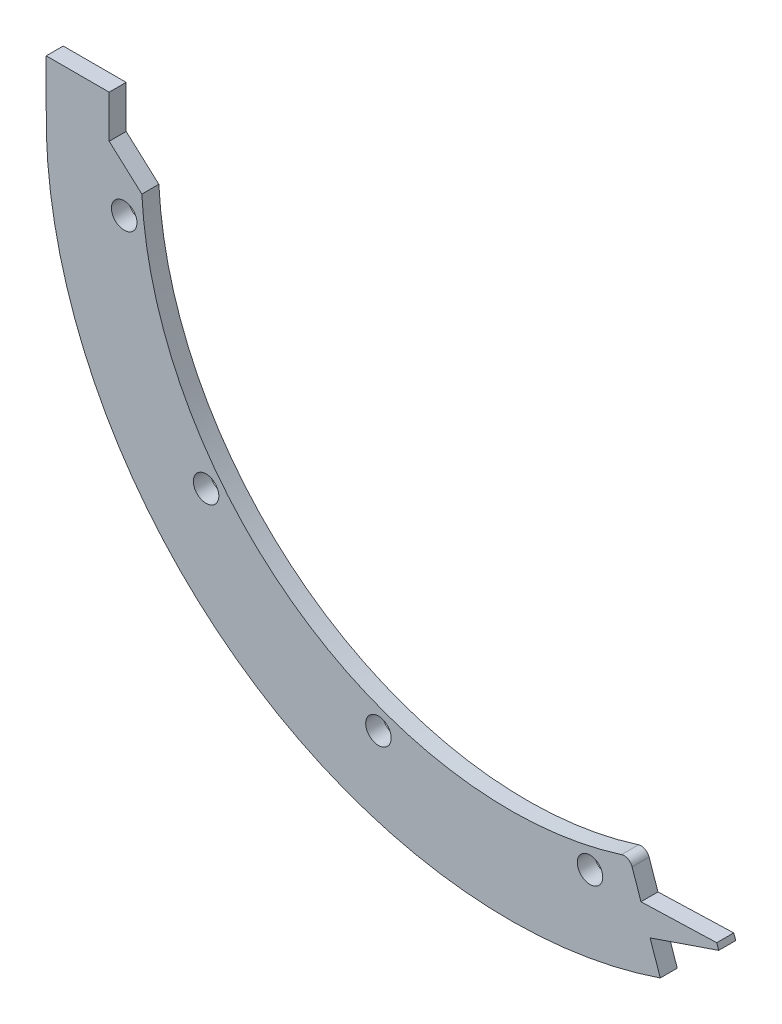
ISO-10303-21;
HEADER;
FILE_DESCRIPTION(('STEP AP214'),'2;1');
FILE_NAME('part.step','',(''),(''),'','','');
FILE_SCHEMA(('AUTOMOTIVE_DESIGN { 1 0 10303 214 1 1 1 1 }'));
ENDSEC;
DATA;
#1=APPLICATION_CONTEXT('core data for automotive mechanical design processes');
#2=APPLICATION_PROTOCOL_DEFINITION('international standard','automotive_design',2000,#1);
#3=PRODUCT_CONTEXT('',#1,'mechanical');
#4=PRODUCT('Part','Part','',(#3));
#5=PRODUCT_RELATED_PRODUCT_CATEGORY('part','',(#4));
#6=PRODUCT_DEFINITION_FORMATION('','',#4);
#7=PRODUCT_DEFINITION_CONTEXT('part definition',#1,'design');
#8=PRODUCT_DEFINITION('design','',#6,#7);
#9=PRODUCT_DEFINITION_SHAPE('','',#8);
#10=(LENGTH_UNIT() NAMED_UNIT(*) SI_UNIT(.MILLI.,.METRE.));
#11=(NAMED_UNIT(*) PLANE_ANGLE_UNIT() SI_UNIT($,.RADIAN.));
#12=(NAMED_UNIT(*) SI_UNIT($,.STERADIAN.) SOLID_ANGLE_UNIT());
#13=UNCERTAINTY_MEASURE_WITH_UNIT(LENGTH_MEASURE(1.E-05),#10,'distance_accuracy_value','');
#14=(GEOMETRIC_REPRESENTATION_CONTEXT(3) GLOBAL_UNCERTAINTY_ASSIGNED_CONTEXT((#13)) GLOBAL_UNIT_ASSIGNED_CONTEXT((#10,
#11,#12)) REPRESENTATION_CONTEXT('',''));
#15=CARTESIAN_POINT('',(0.,0.,0.));
#16=DIRECTION('',(0.,0.,1.));
#17=DIRECTION('',(1.,0.,0.));
#18=AXIS2_PLACEMENT_3D('',#15,#16,#17);
#19=CARTESIAN_POINT('',(11.614625443706,-128.278288384696,2.));
#20=DIRECTION('',(0.,0.,1.));
#21=DIRECTION('',(1.,0.,0.));
#22=AXIS2_PLACEMENT_3D('',#19,#20,#21);
#23=PLANE('',#22);
#24=CARTESIAN_POINT('',(-37.5438954317248,-114.478381177604,2.));
#25=DIRECTION('',(0.,0.,1.));
#26=DIRECTION('',(1.,0.,0.));
#27=AXIS2_PLACEMENT_3D('',#24,#25,#26);
#28=CIRCLE('',#27,1.5);
#29=CARTESIAN_POINT('',(-36.0438954317248,-114.478381177604,2.));
#30=VERTEX_POINT('',#29);
#31=EDGE_CURVE('E175',#30,#30,#28,.T.);
#32=ORIENTED_EDGE('',*,*,#31,.F.);
#33=EDGE_LOOP('',(#32));
#34=FACE_BOUND('',#33,.T.);
#35=CARTESIAN_POINT('',(7.60726233450452,-130.722795016162,2.));
#36=DIRECTION('',(0.,0.,1.));
#37=DIRECTION('',(1.,0.,0.));
#38=AXIS2_PLACEMENT_3D('',#35,#36,#37);
#39=CIRCLE('',#38,1.5);
#40=CARTESIAN_POINT('',(9.10726233450453,-130.722795016162,2.));
#41=VERTEX_POINT('',#40);
#42=EDGE_CURVE('E176',#41,#41,#39,.T.);
#43=ORIENTED_EDGE('',*,*,#42,.F.);
#44=EDGE_LOOP('',(#43));
#45=FACE_BOUND('',#44,.T.);
#46=DIRECTION('',(-0.323851463630344,0.946107937554951,0.));
#47=VECTOR('',#46,1.);
#48=CARTESIAN_POINT('',(13.5976751917569,-130.983785211468,2.));
#49=LINE('',#48,#47);
#50=CARTESIAN_POINT('',(13.5976751917569,-130.983785211468,2.));
#51=VERTEX_POINT('',#50);
#52=CARTESIAN_POINT('',(12.560733381261,-127.954436921066,2.));
#53=VERTEX_POINT('',#52);
#54=EDGE_CURVE('E188',#51,#53,#49,.T.);
#55=ORIENTED_EDGE('',*,*,#54,.T.);
#56=CARTESIAN_POINT('',(11.614625443706,-128.278288384696,2.));
#57=DIRECTION('',(0.,0.,1.));
#58=DIRECTION('',(1.,0.,0.));
#59=AXIS2_PLACEMENT_3D('',#56,#57,#58);
#60=CIRCLE('',#59,1.);
#61=CARTESIAN_POINT('',(11.3121864035106,-127.32511965516,2.));
#62=VERTEX_POINT('',#61);
#63=EDGE_CURVE('E107',#53,#62,#60,.T.);
#64=ORIENTED_EDGE('',*,*,#63,.T.);
#65=CARTESIAN_POINT('',(-1.80021346565739,-86.,2.));
#66=DIRECTION('',(0.,0.,-1.));
#67=DIRECTION('',(1.,0.,0.));
#68=AXIS2_PLACEMENT_3D('',#65,#66,#67);
#69=CIRCLE('',#68,43.3555134307302);
#70=CARTESIAN_POINT('',(-45.0967686238364,-88.2602779202986,2.));
#71=VERTEX_POINT('',#70);
#72=EDGE_CURVE('E192',#62,#71,#69,.T.);
#73=ORIENTED_EDGE('',*,*,#72,.T.);
#74=DIRECTION('',(-0.743201892189276,0.669067221918904,0.));
#75=VECTOR('',#74,1.);
#76=CARTESIAN_POINT('',(-45.0967686238364,-88.2602779202986,2.));
#77=LINE('',#76,#75);
#78=CARTESIAN_POINT('',(-48.9404557954946,-84.8,2.));
#79=VERTEX_POINT('',#78);
#80=EDGE_CURVE('E195',#71,#79,#77,.T.);
#81=ORIENTED_EDGE('',*,*,#80,.T.);
#82=DIRECTION('',(0.,1.,0.));
#83=VECTOR('',#82,1.);
#84=CARTESIAN_POINT('',(-48.9404557954946,-84.8,2.));
#85=LINE('',#84,#83);
#86=CARTESIAN_POINT('',(-48.9404557954946,-79.8,2.));
#87=VERTEX_POINT('',#86);
#88=EDGE_CURVE('E203',#79,#87,#85,.T.);
#89=ORIENTED_EDGE('',*,*,#88,.T.);
#90=DIRECTION('',(-1.,0.,0.));
#91=VECTOR('',#90,1.);
#92=CARTESIAN_POINT('',(-48.9404557954946,-79.8,2.));
#93=LINE('',#92,#91);
#94=CARTESIAN_POINT('',(-56.342527733486,-79.8,2.));
#95=VERTEX_POINT('',#94);
#96=EDGE_CURVE('E205',#87,#95,#93,.T.);
#97=ORIENTED_EDGE('',*,*,#96,.T.);
#98=DIRECTION('',(0.,-1.,0.));
#99=VECTOR('',#98,1.);
#100=CARTESIAN_POINT('',(-56.342527733486,-79.8,2.));
#101=LINE('',#100,#99);
#102=CARTESIAN_POINT('',(-56.342527733486,-84.8,2.));
#103=VERTEX_POINT('',#102);
#104=EDGE_CURVE('E208',#95,#103,#101,.T.);
#105=ORIENTED_EDGE('',*,*,#104,.T.);
#106=CARTESIAN_POINT('',(-1.80021346565739,-86.,2.));
#107=DIRECTION('',(0.,0.,1.));
#108=DIRECTION('',(1.,0.,0.));
#109=AXIS2_PLACEMENT_3D('',#106,#107,#108);
#110=CIRCLE('',#109,54.5555134307302);
#111=CARTESIAN_POINT('',(15.8676694079896,-137.6154042942,2.));
#112=VERTEX_POINT('',#111);
#113=EDGE_CURVE('E211',#103,#112,#110,.T.);
#114=ORIENTED_EDGE('',*,*,#113,.T.);
#115=DIRECTION('',(-0.323851463630345,0.946107937554951,0.));
#116=VECTOR('',#115,1.);
#117=CARTESIAN_POINT('',(15.8676694079896,-137.6154042942,2.));
#118=LINE('',#117,#116);
#119=CARTESIAN_POINT('',(14.6736792549798,-134.127250964701,2.));
#120=VERTEX_POINT('',#119);
#121=EDGE_CURVE('E138',#112,#120,#118,.T.);
#122=ORIENTED_EDGE('',*,*,#121,.T.);
#123=DIRECTION('',(0.946107937554949,0.323851463630349,0.));
#124=VECTOR('',#123,1.);
#125=CARTESIAN_POINT('',(14.6736792549798,-134.127250964701,2.));
#126=LINE('',#125,#124);
#127=CARTESIAN_POINT('',(22.7494643441701,-131.362920683468,2.));
#128=VERTEX_POINT('',#127);
#129=EDGE_CURVE('E132',#120,#128,#126,.T.);
#130=ORIENTED_EDGE('',*,*,#129,.T.);
#131=DIRECTION('',(-0.340722656913194,0.940163853307504,0.));
#132=VECTOR('',#131,1.);
#133=CARTESIAN_POINT('',(22.7494643441701,-131.362920683468,2.));
#134=LINE('',#133,#132);
#135=CARTESIAN_POINT('',(22.5089113422996,-130.699157260125,2.));
#136=VERTEX_POINT('',#135);
#137=EDGE_CURVE('E136',#128,#136,#134,.T.);
#138=ORIENTED_EDGE('',*,*,#137,.T.);
#139=DIRECTION('',(-0.999490297161489,-0.0319240642782076,0.));
#140=VECTOR('',#139,1.);
#141=CARTESIAN_POINT('',(22.5089113422996,-130.699157260125,2.));
#142=LINE('',#141,#140);
#143=EDGE_CURVE('E52',#136,#51,#142,.T.);
#144=ORIENTED_EDGE('',*,*,#143,.T.);
#145=EDGE_LOOP('',(#55,#64,#73,#81,#89,#97,#105,#114,#122,#130,#138,#144));
#146=FACE_BOUND('',#145,.T.);
#147=CARTESIAN_POINT('',(-17.2717739571803,-129.003020951387,2.));
#148=DIRECTION('',(0.,0.,1.));
#149=DIRECTION('',(1.,0.,0.));
#150=AXIS2_PLACEMENT_3D('',#147,#148,#149);
#151=CIRCLE('',#150,1.5);
#152=CARTESIAN_POINT('',(-15.7717739571803,-129.003020951387,2.));
#153=VERTEX_POINT('',#152);
#154=EDGE_CURVE('E164',#153,#153,#151,.T.);
#155=ORIENTED_EDGE('',*,*,#154,.F.);
#156=EDGE_LOOP('',(#155));
#157=FACE_BOUND('',#156,.T.);
#158=CARTESIAN_POINT('',(-47.1727402853457,-91.4738290971626,2.));
#159=DIRECTION('',(0.,0.,1.));
#160=DIRECTION('',(1.,0.,0.));
#161=AXIS2_PLACEMENT_3D('',#158,#159,#160);
#162=CIRCLE('',#161,1.5);
#163=CARTESIAN_POINT('',(-45.6727402853457,-91.4738290971626,2.));
#164=VERTEX_POINT('',#163);
#165=EDGE_CURVE('E455',#164,#164,#162,.T.);
#166=ORIENTED_EDGE('',*,*,#165,.F.);
#167=EDGE_LOOP('',(#166));
#168=FACE_BOUND('',#167,.T.);
#169=ADVANCED_FACE('F35',(#34,#45,#146,#157,#168),#23,.T.);
#170=CARTESIAN_POINT('',(11.614625443706,-128.278288384696,0.));
#171=DIRECTION('',(0.,0.,1.));
#172=DIRECTION('',(1.,0.,0.));
#173=AXIS2_PLACEMENT_3D('',#170,#171,#172);
#174=PLANE('',#173);
#175=DIRECTION('',(-0.323851463630344,0.946107937554951,0.));
#176=VECTOR('',#175,1.);
#177=CARTESIAN_POINT('',(13.5976751917569,-130.983785211468,0.));
#178=LINE('',#177,#176);
#179=CARTESIAN_POINT('',(13.5976751917569,-130.983785211468,0.));
#180=VERTEX_POINT('',#179);
#181=CARTESIAN_POINT('',(12.560733381261,-127.954436921066,0.));
#182=VERTEX_POINT('',#181);
#183=EDGE_CURVE('E180',#180,#182,#178,.T.);
#184=ORIENTED_EDGE('',*,*,#183,.F.);
#185=DIRECTION('',(-0.999490297161489,-0.0319240642782076,0.));
#186=VECTOR('',#185,1.);
#187=CARTESIAN_POINT('',(22.5089113422996,-130.699157260125,0.));
#188=LINE('',#187,#186);
#189=CARTESIAN_POINT('',(22.5089113422996,-130.699157260125,0.));
#190=VERTEX_POINT('',#189);
#191=EDGE_CURVE('E99',#190,#180,#188,.T.);
#192=ORIENTED_EDGE('',*,*,#191,.F.);
#193=DIRECTION('',(-0.340722656913194,0.940163853307504,0.));
#194=VECTOR('',#193,1.);
#195=CARTESIAN_POINT('',(22.7494643441701,-131.362920683468,0.));
#196=LINE('',#195,#194);
#197=CARTESIAN_POINT('',(22.7494643441701,-131.362920683468,0.));
#198=VERTEX_POINT('',#197);
#199=EDGE_CURVE('E93',#198,#190,#196,.T.);
#200=ORIENTED_EDGE('',*,*,#199,.F.);
#201=DIRECTION('',(0.946107937554949,0.323851463630349,0.));
#202=VECTOR('',#201,1.);
#203=CARTESIAN_POINT('',(14.6736792549798,-134.127250964701,0.));
#204=LINE('',#203,#202);
#205=CARTESIAN_POINT('',(14.6736792549798,-134.127250964701,0.));
#206=VERTEX_POINT('',#205);
#207=EDGE_CURVE('E146',#206,#198,#204,.T.);
#208=ORIENTED_EDGE('',*,*,#207,.F.);
#209=DIRECTION('',(-0.323851463630345,0.946107937554951,0.));
#210=VECTOR('',#209,1.);
#211=CARTESIAN_POINT('',(15.8676694079896,-137.6154042942,0.));
#212=LINE('',#211,#210);
#213=CARTESIAN_POINT('',(15.8676694079896,-137.6154042942,0.));
#214=VERTEX_POINT('',#213);
#215=EDGE_CURVE('E231',#214,#206,#212,.T.);
#216=ORIENTED_EDGE('',*,*,#215,.F.);
#217=CARTESIAN_POINT('',(-1.80021346565739,-86.,0.));
#218=DIRECTION('',(0.,0.,1.));
#219=DIRECTION('',(1.,0.,0.));
#220=AXIS2_PLACEMENT_3D('',#217,#218,#219);
#221=CIRCLE('',#220,54.5555134307302);
#222=CARTESIAN_POINT('',(-56.342527733486,-84.8,0.));
#223=VERTEX_POINT('',#222);
#224=EDGE_CURVE('E225',#223,#214,#221,.T.);
#225=ORIENTED_EDGE('',*,*,#224,.F.);
#226=DIRECTION('',(0.,-1.,0.));
#227=VECTOR('',#226,1.);
#228=CARTESIAN_POINT('',(-56.342527733486,-79.8,0.));
#229=LINE('',#228,#227);
#230=CARTESIAN_POINT('',(-56.342527733486,-79.8,0.));
#231=VERTEX_POINT('',#230);
#232=EDGE_CURVE('E270',#231,#223,#229,.T.);
#233=ORIENTED_EDGE('',*,*,#232,.F.);
#234=DIRECTION('',(-1.,0.,0.));
#235=VECTOR('',#234,1.);
#236=CARTESIAN_POINT('',(-48.9404557954946,-79.8,0.));
#237=LINE('',#236,#235);
#238=CARTESIAN_POINT('',(-48.9404557954946,-79.8,0.));
#239=VERTEX_POINT('',#238);
#240=EDGE_CURVE('E268',#239,#231,#237,.T.);
#241=ORIENTED_EDGE('',*,*,#240,.F.);
#242=DIRECTION('',(0.,1.,0.));
#243=VECTOR('',#242,1.);
#244=CARTESIAN_POINT('',(-48.9404557954946,-84.8,0.));
#245=LINE('',#244,#243);
#246=CARTESIAN_POINT('',(-48.9404557954946,-84.8,0.));
#247=VERTEX_POINT('',#246);
#248=EDGE_CURVE('E263',#247,#239,#245,.T.);
#249=ORIENTED_EDGE('',*,*,#248,.F.);
#250=DIRECTION('',(-0.743201892189276,0.669067221918904,0.));
#251=VECTOR('',#250,1.);
#252=CARTESIAN_POINT('',(-45.0967686238364,-88.2602779202986,0.));
#253=LINE('',#252,#251);
#254=CARTESIAN_POINT('',(-45.0967686238364,-88.2602779202986,0.));
#255=VERTEX_POINT('',#254);
#256=EDGE_CURVE('E261',#255,#247,#253,.T.);
#257=ORIENTED_EDGE('',*,*,#256,.F.);
#258=CARTESIAN_POINT('',(-1.80021346565739,-86.,0.));
#259=DIRECTION('',(0.,0.,-1.));
#260=DIRECTION('',(1.,0.,0.));
#261=AXIS2_PLACEMENT_3D('',#258,#259,#260);
#262=CIRCLE('',#261,43.3555134307302);
#263=CARTESIAN_POINT('',(11.3121864035106,-127.32511965516,0.));
#264=VERTEX_POINT('',#263);
#265=EDGE_CURVE('E253',#264,#255,#262,.T.);
#266=ORIENTED_EDGE('',*,*,#265,.F.);
#267=CARTESIAN_POINT('',(11.614625443706,-128.278288384696,0.));
#268=DIRECTION('',(0.,0.,1.));
#269=DIRECTION('',(1.,0.,0.));
#270=AXIS2_PLACEMENT_3D('',#267,#268,#269);
#271=CIRCLE('',#270,1.);
#272=EDGE_CURVE('E259',#182,#264,#271,.T.);
#273=ORIENTED_EDGE('',*,*,#272,.F.);
#274=EDGE_LOOP('',(#184,#192,#200,#208,#216,#225,#233,#241,#249,#257,#266,#273));
#275=FACE_BOUND('',#274,.T.);
#276=CARTESIAN_POINT('',(7.60726233450452,-130.722795016162,0.));
#277=DIRECTION('',(0.,0.,1.));
#278=DIRECTION('',(1.,0.,0.));
#279=AXIS2_PLACEMENT_3D('',#276,#277,#278);
#280=CIRCLE('',#279,1.5);
#281=CARTESIAN_POINT('',(9.10726233450453,-130.722795016162,0.));
#282=VERTEX_POINT('',#281);
#283=EDGE_CURVE('E169',#282,#282,#280,.T.);
#284=ORIENTED_EDGE('',*,*,#283,.T.);
#285=EDGE_LOOP('',(#284));
#286=FACE_BOUND('',#285,.T.);
#287=CARTESIAN_POINT('',(-17.2717739571803,-129.003020951387,0.));
#288=DIRECTION('',(0.,0.,1.));
#289=DIRECTION('',(1.,0.,0.));
#290=AXIS2_PLACEMENT_3D('',#287,#288,#289);
#291=CIRCLE('',#290,1.5);
#292=CARTESIAN_POINT('',(-15.7717739571803,-129.003020951387,0.));
#293=VERTEX_POINT('',#292);
#294=EDGE_CURVE('E170',#293,#293,#291,.T.);
#295=ORIENTED_EDGE('',*,*,#294,.T.);
#296=EDGE_LOOP('',(#295));
#297=FACE_BOUND('',#296,.T.);
#298=CARTESIAN_POINT('',(-37.5438954317248,-114.478381177604,0.));
#299=DIRECTION('',(0.,0.,1.));
#300=DIRECTION('',(1.,0.,0.));
#301=AXIS2_PLACEMENT_3D('',#298,#299,#300);
#302=CIRCLE('',#301,1.5);
#303=CARTESIAN_POINT('',(-36.0438954317248,-114.478381177604,0.));
#304=VERTEX_POINT('',#303);
#305=EDGE_CURVE('E171',#304,#304,#302,.T.);
#306=ORIENTED_EDGE('',*,*,#305,.T.);
#307=EDGE_LOOP('',(#306));
#308=FACE_BOUND('',#307,.T.);
#309=CARTESIAN_POINT('',(-47.1727402853457,-91.4738290971626,0.));
#310=DIRECTION('',(0.,0.,1.));
#311=DIRECTION('',(1.,0.,0.));
#312=AXIS2_PLACEMENT_3D('',#309,#310,#311);
#313=CIRCLE('',#312,1.5);
#314=CARTESIAN_POINT('',(-45.6727402853457,-91.4738290971626,0.));
#315=VERTEX_POINT('',#314);
#316=EDGE_CURVE('E458',#315,#315,#313,.T.);
#317=ORIENTED_EDGE('',*,*,#316,.T.);
#318=EDGE_LOOP('',(#317));
#319=FACE_BOUND('',#318,.T.);
#320=ADVANCED_FACE('F257',(#275,#286,#297,#308,#319),#174,.F.);
#321=CARTESIAN_POINT('',(13.5976751917569,-130.983785211468,2.));
#322=DIRECTION('',(-0.946107937554951,-0.323851463630344,0.));
#323=DIRECTION('',(0.323851463630344,-0.946107937554951,0.));
#324=AXIS2_PLACEMENT_3D('',#321,#322,#323);
#325=PLANE('',#324);
#326=ORIENTED_EDGE('',*,*,#183,.T.);
#327=DIRECTION('',(0.,0.,-1.));
#328=VECTOR('',#327,1.);
#329=CARTESIAN_POINT('',(12.560733381261,-127.954436921066,2.));
#330=LINE('',#329,#328);
#331=EDGE_CURVE('E12',#53,#182,#330,.T.);
#332=ORIENTED_EDGE('',*,*,#331,.F.);
#333=ORIENTED_EDGE('',*,*,#54,.F.);
#334=DIRECTION('',(0.,0.,-1.));
#335=VECTOR('',#334,1.);
#336=CARTESIAN_POINT('',(13.5976751917569,-130.983785211468,2.));
#337=LINE('',#336,#335);
#338=EDGE_CURVE('E152',#51,#180,#337,.T.);
#339=ORIENTED_EDGE('',*,*,#338,.T.);
#340=EDGE_LOOP('',(#326,#332,#333,#339));
#341=FACE_BOUND('',#340,.T.);
#342=ADVANCED_FACE('F37',(#341),#325,.F.);
#343=CARTESIAN_POINT('',(11.614625443706,-128.278288384696,2.));
#344=DIRECTION('',(0.,0.,-1.));
#345=DIRECTION('',(-1.,0.,0.));
#346=AXIS2_PLACEMENT_3D('',#343,#344,#345);
#347=CYLINDRICAL_SURFACE('',#346,1.);
#348=ORIENTED_EDGE('',*,*,#272,.T.);
#349=DIRECTION('',(0.,0.,-1.));
#350=VECTOR('',#349,1.);
#351=CARTESIAN_POINT('',(11.3121864035106,-127.32511965516,2.));
#352=LINE('',#351,#350);
#353=EDGE_CURVE('E44',#62,#264,#352,.T.);
#354=ORIENTED_EDGE('',*,*,#353,.F.);
#355=ORIENTED_EDGE('',*,*,#63,.F.);
#356=ORIENTED_EDGE('',*,*,#331,.T.);
#357=EDGE_LOOP('',(#348,#354,#355,#356));
#358=FACE_BOUND('',#357,.T.);
#359=ADVANCED_FACE('F422',(#358),#347,.T.);
#360=CARTESIAN_POINT('',(-1.80021346565739,-86.,2.));
#361=DIRECTION('',(0.,0.,-1.));
#362=DIRECTION('',(-1.,0.,0.));
#363=AXIS2_PLACEMENT_3D('',#360,#361,#362);
#364=CYLINDRICAL_SURFACE('',#363,43.3555134307302);
#365=ORIENTED_EDGE('',*,*,#265,.T.);
#366=DIRECTION('',(0.,0.,-1.));
#367=VECTOR('',#366,1.);
#368=CARTESIAN_POINT('',(-45.0967686238364,-88.2602779202986,2.));
#369=LINE('',#368,#367);
#370=EDGE_CURVE('E245',#71,#255,#369,.T.);
#371=ORIENTED_EDGE('',*,*,#370,.F.);
#372=ORIENTED_EDGE('',*,*,#72,.F.);
#373=ORIENTED_EDGE('',*,*,#353,.T.);
#374=EDGE_LOOP('',(#365,#371,#372,#373));
#375=FACE_BOUND('',#374,.T.);
#376=ADVANCED_FACE('F251',(#375),#364,.F.);
#377=CARTESIAN_POINT('',(-45.0967686238364,-88.2602779202986,2.));
#378=DIRECTION('',(-0.669067221918904,-0.743201892189276,0.));
#379=DIRECTION('',(0.743201892189276,-0.669067221918904,0.));
#380=AXIS2_PLACEMENT_3D('',#377,#378,#379);
#381=PLANE('',#380);
#382=ORIENTED_EDGE('',*,*,#256,.T.);
#383=DIRECTION('',(0.,0.,-1.));
#384=VECTOR('',#383,1.);
#385=CARTESIAN_POINT('',(-48.9404557954946,-84.8,2.));
#386=LINE('',#385,#384);
#387=EDGE_CURVE('E242',#79,#247,#386,.T.);
#388=ORIENTED_EDGE('',*,*,#387,.F.);
#389=ORIENTED_EDGE('',*,*,#80,.F.);
#390=ORIENTED_EDGE('',*,*,#370,.T.);
#391=EDGE_LOOP('',(#382,#388,#389,#390));
#392=FACE_BOUND('',#391,.T.);
#393=ADVANCED_FACE('F285',(#392),#381,.F.);
#394=CARTESIAN_POINT('',(-48.9404557954946,-84.8,2.));
#395=DIRECTION('',(-1.,0.,0.));
#396=DIRECTION('',(0.,0.,1.));
#397=AXIS2_PLACEMENT_3D('',#394,#395,#396);
#398=PLANE('',#397);
#399=ORIENTED_EDGE('',*,*,#248,.T.);
#400=DIRECTION('',(0.,0.,-1.));
#401=VECTOR('',#400,1.);
#402=CARTESIAN_POINT('',(-48.9404557954946,-79.8,2.));
#403=LINE('',#402,#401);
#404=EDGE_CURVE('E239',#87,#239,#403,.T.);
#405=ORIENTED_EDGE('',*,*,#404,.F.);
#406=ORIENTED_EDGE('',*,*,#88,.F.);
#407=ORIENTED_EDGE('',*,*,#387,.T.);
#408=EDGE_LOOP('',(#399,#405,#406,#407));
#409=FACE_BOUND('',#408,.T.);
#410=ADVANCED_FACE('F289',(#409),#398,.F.);
#411=CARTESIAN_POINT('',(-48.9404557954946,-79.8,2.));
#412=DIRECTION('',(0.,-1.,0.));
#413=DIRECTION('',(0.,0.,-1.));
#414=AXIS2_PLACEMENT_3D('',#411,#412,#413);
#415=PLANE('',#414);
#416=ORIENTED_EDGE('',*,*,#240,.T.);
#417=DIRECTION('',(0.,0.,-1.));
#418=VECTOR('',#417,1.);
#419=CARTESIAN_POINT('',(-56.342527733486,-79.8,2.));
#420=LINE('',#419,#418);
#421=EDGE_CURVE('E236',#95,#231,#420,.T.);
#422=ORIENTED_EDGE('',*,*,#421,.F.);
#423=ORIENTED_EDGE('',*,*,#96,.F.);
#424=ORIENTED_EDGE('',*,*,#404,.T.);
#425=EDGE_LOOP('',(#416,#422,#423,#424));
#426=FACE_BOUND('',#425,.T.);
#427=ADVANCED_FACE('F293',(#426),#415,.F.);
#428=CARTESIAN_POINT('',(-56.342527733486,-79.8,2.));
#429=DIRECTION('',(1.,0.,0.));
#430=DIRECTION('',(0.,0.,-1.));
#431=AXIS2_PLACEMENT_3D('',#428,#429,#430);
#432=PLANE('',#431);
#433=ORIENTED_EDGE('',*,*,#232,.T.);
#434=DIRECTION('',(0.,0.,-1.));
#435=VECTOR('',#434,1.);
#436=CARTESIAN_POINT('',(-56.342527733486,-84.8,2.));
#437=LINE('',#436,#435);
#438=EDGE_CURVE('E228',#103,#223,#437,.T.);
#439=ORIENTED_EDGE('',*,*,#438,.F.);
#440=ORIENTED_EDGE('',*,*,#104,.F.);
#441=ORIENTED_EDGE('',*,*,#421,.T.);
#442=EDGE_LOOP('',(#433,#439,#440,#441));
#443=FACE_BOUND('',#442,.T.);
#444=ADVANCED_FACE('F297',(#443),#432,.F.);
#445=CARTESIAN_POINT('',(-1.80021346565739,-86.,2.));
#446=DIRECTION('',(0.,0.,-1.));
#447=DIRECTION('',(-1.,0.,0.));
#448=AXIS2_PLACEMENT_3D('',#445,#446,#447);
#449=CYLINDRICAL_SURFACE('',#448,54.5555134307302);
#450=ORIENTED_EDGE('',*,*,#224,.T.);
#451=DIRECTION('',(0.,0.,-1.));
#452=VECTOR('',#451,1.);
#453=CARTESIAN_POINT('',(15.8676694079896,-137.6154042942,2.));
#454=LINE('',#453,#452);
#455=EDGE_CURVE('E222',#112,#214,#454,.T.);
#456=ORIENTED_EDGE('',*,*,#455,.F.);
#457=ORIENTED_EDGE('',*,*,#113,.F.);
#458=ORIENTED_EDGE('',*,*,#438,.T.);
#459=EDGE_LOOP('',(#450,#456,#457,#458));
#460=FACE_BOUND('',#459,.T.);
#461=ADVANCED_FACE('F223',(#460),#449,.T.);
#462=CARTESIAN_POINT('',(15.8676694079896,-137.6154042942,2.));
#463=DIRECTION('',(-0.946107937554951,-0.323851463630345,0.));
#464=DIRECTION('',(0.323851463630345,-0.946107937554951,0.));
#465=AXIS2_PLACEMENT_3D('',#462,#463,#464);
#466=PLANE('',#465);
#467=ORIENTED_EDGE('',*,*,#215,.T.);
#468=DIRECTION('',(0.,0.,-1.));
#469=VECTOR('',#468,1.);
#470=CARTESIAN_POINT('',(14.6736792549798,-134.127250964701,2.));
#471=LINE('',#470,#469);
#472=EDGE_CURVE('E147',#120,#206,#471,.T.);
#473=ORIENTED_EDGE('',*,*,#472,.F.);
#474=ORIENTED_EDGE('',*,*,#121,.F.);
#475=ORIENTED_EDGE('',*,*,#455,.T.);
#476=EDGE_LOOP('',(#467,#473,#474,#475));
#477=FACE_BOUND('',#476,.T.);
#478=ADVANCED_FACE('F230',(#477),#466,.F.);
#479=CARTESIAN_POINT('',(14.6736792549798,-134.127250964701,2.));
#480=DIRECTION('',(-0.323851463630349,0.94610793755495,0.));
#481=DIRECTION('',(-0.94610793755495,-0.323851463630349,0.));
#482=AXIS2_PLACEMENT_3D('',#479,#480,#481);
#483=PLANE('',#482);
#484=ORIENTED_EDGE('',*,*,#207,.T.);
#485=DIRECTION('',(0.,0.,-1.));
#486=VECTOR('',#485,1.);
#487=CARTESIAN_POINT('',(22.7494643441701,-131.362920683468,2.));
#488=LINE('',#487,#486);
#489=EDGE_CURVE('E143',#128,#198,#488,.T.);
#490=ORIENTED_EDGE('',*,*,#489,.F.);
#491=ORIENTED_EDGE('',*,*,#129,.F.);
#492=ORIENTED_EDGE('',*,*,#472,.T.);
#493=EDGE_LOOP('',(#484,#490,#491,#492));
#494=FACE_BOUND('',#493,.T.);
#495=ADVANCED_FACE('F144',(#494),#483,.F.);
#496=CARTESIAN_POINT('',(22.7494643441701,-131.362920683468,2.));
#497=DIRECTION('',(-0.940163853307504,-0.340722656913194,0.));
#498=DIRECTION('',(0.340722656913194,-0.940163853307504,0.));
#499=AXIS2_PLACEMENT_3D('',#496,#497,#498);
#500=PLANE('',#499);
#501=ORIENTED_EDGE('',*,*,#199,.T.);
#502=DIRECTION('',(0.,0.,-1.));
#503=VECTOR('',#502,1.);
#504=CARTESIAN_POINT('',(22.5089113422996,-130.699157260125,2.));
#505=LINE('',#504,#503);
#506=EDGE_CURVE('E148',#136,#190,#505,.T.);
#507=ORIENTED_EDGE('',*,*,#506,.F.);
#508=ORIENTED_EDGE('',*,*,#137,.F.);
#509=ORIENTED_EDGE('',*,*,#489,.T.);
#510=EDGE_LOOP('',(#501,#507,#508,#509));
#511=FACE_BOUND('',#510,.T.);
#512=ADVANCED_FACE('F150',(#511),#500,.F.);
#513=CARTESIAN_POINT('',(22.5089113422996,-130.699157260125,2.));
#514=DIRECTION('',(0.0319240642782076,-0.999490297161489,0.));
#515=DIRECTION('',(0.999490297161489,0.0319240642782076,0.));
#516=AXIS2_PLACEMENT_3D('',#513,#514,#515);
#517=PLANE('',#516);
#518=ORIENTED_EDGE('',*,*,#191,.T.);
#519=ORIENTED_EDGE('',*,*,#338,.F.);
#520=ORIENTED_EDGE('',*,*,#143,.F.);
#521=ORIENTED_EDGE('',*,*,#506,.T.);
#522=EDGE_LOOP('',(#518,#519,#520,#521));
#523=FACE_BOUND('',#522,.T.);
#524=ADVANCED_FACE('F277',(#523),#517,.F.);
#525=CARTESIAN_POINT('',(7.60726233450452,-130.722795016162,2.));
#526=DIRECTION('',(0.,0.,-1.));
#527=DIRECTION('',(-1.,0.,0.));
#528=AXIS2_PLACEMENT_3D('',#525,#526,#527);
#529=CYLINDRICAL_SURFACE('',#528,1.5);
#530=ORIENTED_EDGE('',*,*,#42,.T.);
#531=EDGE_LOOP('',(#530));
#532=FACE_BOUND('',#531,.T.);
#533=ORIENTED_EDGE('',*,*,#283,.F.);
#534=EDGE_LOOP('',(#533));
#535=FACE_BOUND('',#534,.T.);
#536=ADVANCED_FACE('F316',(#532,#535),#529,.F.);
#537=CARTESIAN_POINT('',(-17.2717739571803,-129.003020951387,2.));
#538=DIRECTION('',(0.,0.,-1.));
#539=DIRECTION('',(-1.,0.,0.));
#540=AXIS2_PLACEMENT_3D('',#537,#538,#539);
#541=CYLINDRICAL_SURFACE('',#540,1.5);
#542=ORIENTED_EDGE('',*,*,#154,.T.);
#543=EDGE_LOOP('',(#542));
#544=FACE_BOUND('',#543,.T.);
#545=ORIENTED_EDGE('',*,*,#294,.F.);
#546=EDGE_LOOP('',(#545));
#547=FACE_BOUND('',#546,.T.);
#548=ADVANCED_FACE('F348',(#544,#547),#541,.F.);
#549=CARTESIAN_POINT('',(-37.5438954317248,-114.478381177604,2.));
#550=DIRECTION('',(0.,0.,-1.));
#551=DIRECTION('',(-1.,0.,0.));
#552=AXIS2_PLACEMENT_3D('',#549,#550,#551);
#553=CYLINDRICAL_SURFACE('',#552,1.5);
#554=ORIENTED_EDGE('',*,*,#31,.T.);
#555=EDGE_LOOP('',(#554));
#556=FACE_BOUND('',#555,.T.);
#557=ORIENTED_EDGE('',*,*,#305,.F.);
#558=EDGE_LOOP('',(#557));
#559=FACE_BOUND('',#558,.T.);
#560=ADVANCED_FACE('F355',(#556,#559),#553,.F.);
#561=CARTESIAN_POINT('',(-47.1727402853457,-91.4738290971626,2.));
#562=DIRECTION('',(0.,0.,-1.));
#563=DIRECTION('',(-1.,0.,0.));
#564=AXIS2_PLACEMENT_3D('',#561,#562,#563);
#565=CYLINDRICAL_SURFACE('',#564,1.5);
#566=ORIENTED_EDGE('',*,*,#165,.T.);
#567=EDGE_LOOP('',(#566));
#568=FACE_BOUND('',#567,.T.);
#569=ORIENTED_EDGE('',*,*,#316,.F.);
#570=EDGE_LOOP('',(#569));
#571=FACE_BOUND('',#570,.T.);
#572=ADVANCED_FACE('F362',(#568,#571),#565,.F.);
#573=CLOSED_SHELL('',(#169,#320,#342,#359,#376,#393,#410,#427,#444,#461,#478,#495,#512,#524,
#536,#548,#560,#572));
#574=MANIFOLD_SOLID_BREP('B2',#573);
#575=ADVANCED_BREP_SHAPE_REPRESENTATION('',(#18,#574),#14);
#576=SHAPE_DEFINITION_REPRESENTATION(#9,#575);
ENDSEC;
END-ISO-10303-21;
